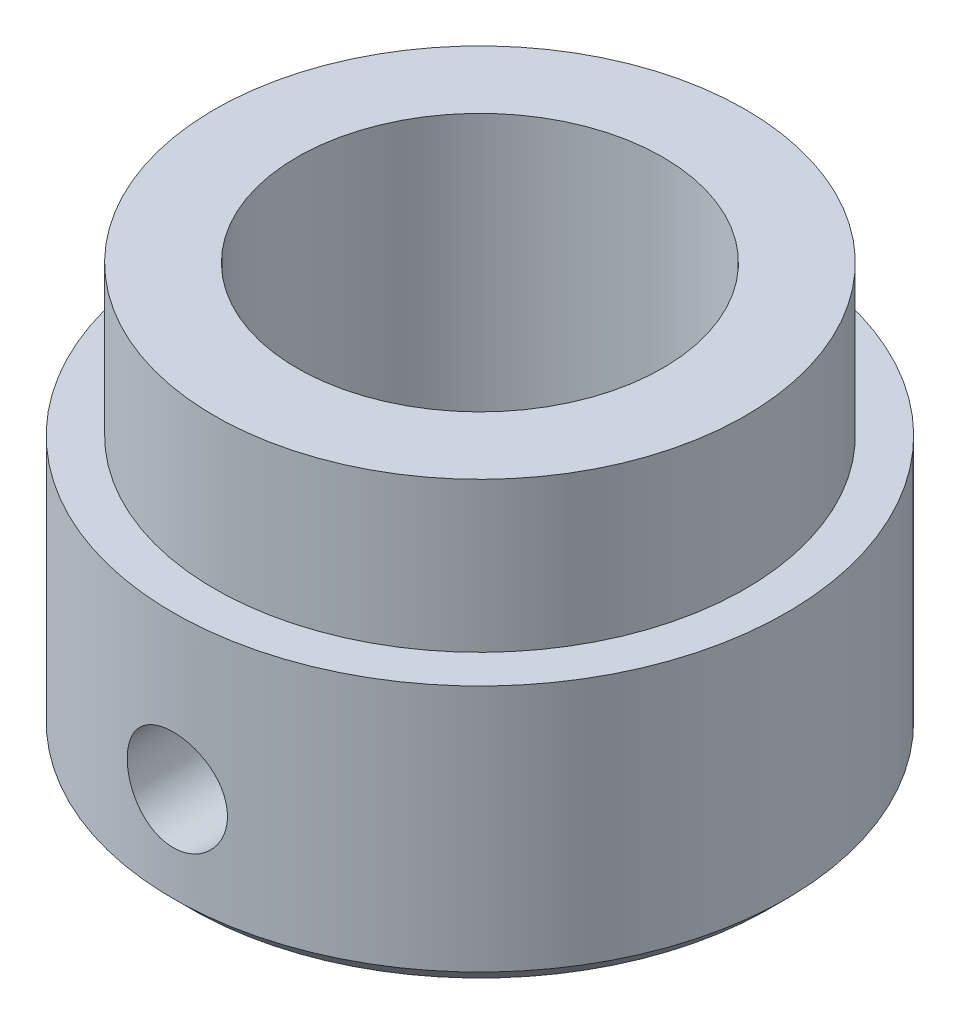
ISO-10303-21;
HEADER;
FILE_DESCRIPTION(('STEP AP214'),'2;1');
FILE_NAME('part.step','',(''),(''),'','','');
FILE_SCHEMA(('AUTOMOTIVE_DESIGN { 1 0 10303 214 1 1 1 1 }'));
ENDSEC;
DATA;
#1=APPLICATION_CONTEXT('core data for automotive mechanical design processes');
#2=APPLICATION_PROTOCOL_DEFINITION('international standard','automotive_design',2000,#1);
#3=PRODUCT_CONTEXT('',#1,'mechanical');
#4=PRODUCT('Part','Part','',(#3));
#5=PRODUCT_RELATED_PRODUCT_CATEGORY('part','',(#4));
#6=PRODUCT_DEFINITION_FORMATION('','',#4);
#7=PRODUCT_DEFINITION_CONTEXT('part definition',#1,'design');
#8=PRODUCT_DEFINITION('design','',#6,#7);
#9=PRODUCT_DEFINITION_SHAPE('','',#8);
#10=(LENGTH_UNIT() NAMED_UNIT(*) SI_UNIT(.MILLI.,.METRE.));
#11=(NAMED_UNIT(*) PLANE_ANGLE_UNIT() SI_UNIT($,.RADIAN.));
#12=(NAMED_UNIT(*) SI_UNIT($,.STERADIAN.) SOLID_ANGLE_UNIT());
#13=UNCERTAINTY_MEASURE_WITH_UNIT(LENGTH_MEASURE(1.E-05),#10,'distance_accuracy_value','');
#14=(GEOMETRIC_REPRESENTATION_CONTEXT(3) GLOBAL_UNCERTAINTY_ASSIGNED_CONTEXT((#13)) GLOBAL_UNIT_ASSIGNED_CONTEXT((#10,
#11,#12)) REPRESENTATION_CONTEXT('',''));
#15=CARTESIAN_POINT('',(0.,0.,0.));
#16=DIRECTION('',(0.,0.,1.));
#17=DIRECTION('',(1.,0.,0.));
#18=AXIS2_PLACEMENT_3D('',#15,#16,#17);
#19=CARTESIAN_POINT('',(0.,35.2,-22.5));
#20=DIRECTION('',(0.,1.,0.));
#21=DIRECTION('',(0.,0.,1.));
#22=AXIS2_PLACEMENT_3D('',#19,#20,#21);
#23=PLANE('',#22);
#24=CARTESIAN_POINT('',(0.,35.2,0.));
#25=DIRECTION('',(0.,-1.,0.));
#26=DIRECTION('',(0.,0.,-1.));
#27=AXIS2_PLACEMENT_3D('',#24,#25,#26);
#28=CIRCLE('',#27,15.5);
#29=CARTESIAN_POINT('',(0.,35.2,-15.5));
#30=VERTEX_POINT('',#29);
#31=EDGE_CURVE('E52',#30,#30,#28,.T.);
#32=ORIENTED_EDGE('',*,*,#31,.T.);
#33=EDGE_LOOP('',(#32));
#34=FACE_BOUND('',#33,.T.);
#35=CARTESIAN_POINT('',(0.,35.2,0.));
#36=DIRECTION('',(0.,-1.,0.));
#37=DIRECTION('',(0.,0.,-1.));
#38=AXIS2_PLACEMENT_3D('',#35,#36,#37);
#39=CIRCLE('',#38,22.5);
#40=CARTESIAN_POINT('',(0.,35.2,-22.5));
#41=VERTEX_POINT('',#40);
#42=EDGE_CURVE('E116',#41,#41,#39,.T.);
#43=ORIENTED_EDGE('',*,*,#42,.F.);
#44=EDGE_LOOP('',(#43));
#45=FACE_BOUND('',#44,.T.);
#46=ADVANCED_FACE('F37',(#34,#45),#23,.T.);
#47=CARTESIAN_POINT('',(0.,0.,0.));
#48=DIRECTION('',(0.,-1.,0.));
#49=DIRECTION('',(0.,0.,-1.));
#50=AXIS2_PLACEMENT_3D('',#47,#48,#49);
#51=CYLINDRICAL_SURFACE('',#50,15.5);
#52=CARTESIAN_POINT('',(0.,13.75,-15.5));
#53=CARTESIAN_POINT('',(-0.234044001094828,13.7499949715793,-15.499996731683));
#54=CARTESIAN_POINT('',(-0.468140955193607,13.7306024008031,-15.4946471869299));
#55=CARTESIAN_POINT('',(-0.929575137245832,13.6536918309459,-15.4738269408786));
#56=CARTESIAN_POINT('',(-1.15690933644533,13.5961570103571,-15.4583517740144));
#57=CARTESIAN_POINT('',(-1.59809192774814,13.4449852044156,-15.4189856764472));
#58=CARTESIAN_POINT('',(-1.81195782155555,13.3513962458422,-15.3951059448869));
#59=CARTESIAN_POINT('',(-2.22095917984194,13.1309550198842,-15.341445268166));
#60=CARTESIAN_POINT('',(-2.41609311354263,13.0041000371514,-15.3116638413264));
#61=CARTESIAN_POINT('',(-2.78685169926926,12.7174616144645,-15.2485943993305));
#62=CARTESIAN_POINT('',(-2.96195434683536,12.5570167481063,-15.2152437821519));
#63=CARTESIAN_POINT('',(-3.28313469107956,12.2091659503002,-15.1491903955612));
#64=CARTESIAN_POINT('',(-3.42920842010207,12.0217563393536,-15.116487715258));
#65=CARTESIAN_POINT('',(-3.69077270707633,11.6210754362609,-15.0547879758193));
#66=CARTESIAN_POINT('',(-3.80565486995462,11.4073937404046,-15.0258696546645));
#67=CARTESIAN_POINT('',(-3.99765325734526,10.9628261755669,-14.9759366632652));
#68=CARTESIAN_POINT('',(-4.07477689094871,10.7319436920281,-14.954920442635));
#69=CARTESIAN_POINT('',(-4.18724098268469,10.2653279855075,-14.9238188380682));
#70=CARTESIAN_POINT('',(-4.22353143606881,10.0298406760787,-14.9134854022584));
#71=CARTESIAN_POINT('',(-4.25626189725561,9.55591100621531,-14.9041789095926));
#72=CARTESIAN_POINT('',(-4.25270981543657,9.31746924175145,-14.9052035976823));
#73=CARTESIAN_POINT('',(-4.20660848470758,8.85187925134541,-14.9182760282656));
#74=CARTESIAN_POINT('',(-4.1652172768483,8.62460569396154,-14.9299964173477));
#75=CARTESIAN_POINT('',(-4.04647089890425,8.18035961235423,-14.9626143320436));
#76=CARTESIAN_POINT('',(-3.96911270819449,7.96338795500518,-14.98351262844));
#77=CARTESIAN_POINT('',(-3.77970462779636,7.54292667200969,-15.0324136439593));
#78=CARTESIAN_POINT('',(-3.66725541632669,7.33962675940414,-15.0604974324522));
#79=CARTESIAN_POINT('',(-3.41113562126779,6.95437915555299,-15.1205625276303));
#80=CARTESIAN_POINT('',(-3.26745857659147,6.77243589504723,-15.1525446402825));
#81=CARTESIAN_POINT('',(-2.94707704301829,6.42845986304408,-15.2181579180777));
#82=CARTESIAN_POINT('',(-2.76940246030864,6.26733289294649,-15.251807868619));
#83=CARTESIAN_POINT('',(-2.38914055693715,5.97697070036936,-15.3159763811667));
#84=CARTESIAN_POINT('',(-2.18655214052904,5.84773688134868,-15.3464948053358));
#85=CARTESIAN_POINT('',(-1.76075824631216,5.62439875569531,-15.4011675640127));
#86=CARTESIAN_POINT('',(-1.53745833078028,5.53046632774554,-15.4252905965909));
#87=CARTESIAN_POINT('',(-1.07742212093377,5.38174038619159,-15.4642286659677));
#88=CARTESIAN_POINT('',(-0.840688950295692,5.3269378135333,-15.47904585709));
#89=CARTESIAN_POINT('',(-0.368229946585817,5.25946789596467,-15.4973736882661));
#90=CARTESIAN_POINT('',(-0.132692392724793,5.24556993014552,-15.5012144495724));
#91=CARTESIAN_POINT('',(0.33735084052852,5.25689425513536,-15.4981099773144));
#92=CARTESIAN_POINT('',(0.571856630335981,5.28211225250341,-15.4911659275108));
#93=CARTESIAN_POINT('',(1.02873270088103,5.36994599320293,-15.4674860084727));
#94=CARTESIAN_POINT('',(1.25124658803462,5.4318682619595,-15.4509318255765));
#95=CARTESIAN_POINT('',(1.68270126622545,5.59054125016057,-15.4099163482131));
#96=CARTESIAN_POINT('',(1.89164054218499,5.68729584942477,-15.3854541729405));
#97=CARTESIAN_POINT('',(2.29474224666484,5.91512203120913,-15.3305712481264));
#98=CARTESIAN_POINT('',(2.48851602769114,6.04685373750241,-15.3000390711386));
#99=CARTESIAN_POINT('',(2.85163728322288,6.34007113627468,-15.2365416583241));
#100=CARTESIAN_POINT('',(3.02097963448717,6.50156305331177,-15.203575914366));
#101=CARTESIAN_POINT('',(3.33566884782591,6.85547070265499,-15.1377003503809));
#102=CARTESIAN_POINT('',(3.48014547996119,7.04866753572763,-15.1048217556789));
#103=CARTESIAN_POINT('',(3.73465585782006,7.45726507967922,-15.0439202027301));
#104=CARTESIAN_POINT('',(3.84469096511805,7.67266491236089,-15.0158970525529));
#105=CARTESIAN_POINT('',(4.02637194319855,8.11853924080239,-14.9682048735325));
#106=CARTESIAN_POINT('',(4.09823434046443,8.34892020671649,-14.9484888591061));
#107=CARTESIAN_POINT('',(4.20200511593053,8.81913411036364,-14.9196551229962));
#108=CARTESIAN_POINT('',(4.23392442533741,9.05896444355182,-14.9105345017253));
#109=CARTESIAN_POINT('',(4.25624818687573,9.53233280808543,-14.9041761336467));
#110=CARTESIAN_POINT('',(4.24805532970032,9.76580025773756,-14.9065368731631));
#111=CARTESIAN_POINT('',(4.19366154127966,10.2278879581205,-14.9219296692385));
#112=CARTESIAN_POINT('',(4.14746169665383,10.4565083472371,-14.9349614207134));
#113=CARTESIAN_POINT('',(4.01919971009858,10.9005332611036,-14.9699820288537));
#114=CARTESIAN_POINT('',(3.93745084277996,11.1160348983246,-14.9918925294361));
#115=CARTESIAN_POINT('',(3.74065386562867,11.5304302521745,-15.0421999009591));
#116=CARTESIAN_POINT('',(3.62560026430372,11.7293212229588,-15.0705978414262));
#117=CARTESIAN_POINT('',(3.36127670626323,12.111505186541,-15.1317789550165));
#118=CARTESIAN_POINT('',(3.21105727787171,12.294124197332,-15.1646707151057));
#119=CARTESIAN_POINT('',(2.88245093271624,12.6320176921118,-15.2305453174083));
#120=CARTESIAN_POINT('',(2.70405708806336,12.7872854307005,-15.2635281800583));
#121=CARTESIAN_POINT('',(2.31921438798124,13.0695923409439,-15.3267768363415));
#122=CARTESIAN_POINT('',(2.11221446041559,13.195899803058,-15.3569626516391));
#123=CARTESIAN_POINT('',(1.6790946232493,13.4117263385824,-15.4103247757236));
#124=CARTESIAN_POINT('',(1.452986386777,13.5012676790432,-15.4335053249301));
#125=CARTESIAN_POINT('',(1.0232861933147,13.6301160119318,-15.4674539867558));
#126=CARTESIAN_POINT('',(0.821445326763272,13.6749645042732,-15.4795673114937));
#127=CARTESIAN_POINT('',(0.413083039792351,13.7349070592233,-15.4958413172267));
#128=CARTESIAN_POINT('',(0.206562143617999,13.7500044379747,-15.5000028845455));
#129=CARTESIAN_POINT('',(0.,13.75,-15.5));
#130=B_SPLINE_CURVE_WITH_KNOTS('',3,(#52,#53,#54,#55,#56,#57,#58,#59,#60,#61,#62,#63,#64,#65,
#66,#67,#68,#69,#70,#71,#72,#73,#74,#75,#76,#77,#78,#79,#80,#81,#82,#83,#84,#85,#86,#87,#88,#89,
#90,#91,#92,#93,#94,#95,#96,#97,#98,#99,#100,#101,#102,#103,#104,#105,#106,#107,#108,#109,#110,
#111,#112,#113,#114,#115,#116,#117,#118,#119,#120,#121,#122,#123,#124,#125,#126,#127,#128,#129),
.UNSPECIFIED.,.T.,.F.,(4,2,2,2,2,2,2,2,2,2,2,2,2,2,2,2,2,2,2,2,2,2,2,2,2,2,2,2,2,2,2,2,2,2,2,2,
2,2,4),(0.,0.701374224424725,1.40305797510329,2.1038102451622,2.80461973212783,3.52080598898643,
4.23709006654045,4.96647824341192,5.69572324014229,6.40762671701645,7.1193888543378,
7.81007170937728,8.50081258070493,9.19971956028486,9.89877128269117,10.6219904743086,
11.3452414855307,12.0719696590743,12.7985295312965,13.5029953113035,14.2073837733063,
14.8988699682275,15.590433208589,16.2961116879339,17.0019379327788,17.7288967373787,
18.4558267995356,19.1785882449314,19.9011518492435,20.5986322210377,21.2960926525672,
21.9875274908931,22.6790764023118,23.3920462535982,24.1051916928481,24.8347458454454,
25.563857496486,26.1829441372441,26.8019617689624),.UNSPECIFIED.);
#131=CARTESIAN_POINT('',(0.,13.75,-15.5));
#132=VERTEX_POINT('',#131);
#133=EDGE_CURVE('E83',#132,#132,#130,.T.);
#134=ORIENTED_EDGE('',*,*,#133,.F.);
#135=EDGE_LOOP('',(#134));
#136=FACE_BOUND('',#135,.T.);
#137=CARTESIAN_POINT('',(4.25,9.5,14.9059551857638));
#138=CARTESIAN_POINT('',(4.24999488522442,9.26614256857367,14.9059589746067));
#139=CARTESIAN_POINT('',(4.2306321464448,9.0322320276617,14.9115188036944));
#140=CARTESIAN_POINT('',(4.15385079292532,8.57118432527488,14.933086165905));
#141=CARTESIAN_POINT('',(4.09641450051364,8.34405036140302,14.9490985521307));
#142=CARTESIAN_POINT('',(3.94553055670862,7.9032927776466,14.9896241970184));
#143=CARTESIAN_POINT('',(3.85213551620893,7.68964994811186,15.014125031094));
#144=CARTESIAN_POINT('',(3.63215195534969,7.28102739819685,15.0688509028496));
#145=CARTESIAN_POINT('',(3.50556032035812,7.08604943137011,15.0990764775727));
#146=CARTESIAN_POINT('',(3.21919692306056,6.71513623875528,15.1627418652733));
#147=CARTESIAN_POINT('',(3.05870439202163,6.53976758531231,15.1962412382274));
#148=CARTESIAN_POINT('',(2.71064396300684,6.21806776129983,15.2621667890378));
#149=CARTESIAN_POINT('',(2.52307312461681,6.07173974833607,15.2945928498733));
#150=CARTESIAN_POINT('',(2.12222978962298,5.80989130254843,15.3553854582037));
#151=CARTESIAN_POINT('',(1.9085743727651,5.69493725784382,15.3836735693965));
#152=CARTESIAN_POINT('',(1.46406257328754,5.50279896552384,15.4323177349872));
#153=CARTESIAN_POINT('',(1.23320927244565,5.425607969622,15.4526752064641));
#154=CARTESIAN_POINT('',(0.766771757966198,5.31302953418498,15.4827431563299));
#155=CARTESIAN_POINT('',(0.531436426250142,5.27667757857654,15.4926988815174));
#156=CARTESIAN_POINT('',(0.0578109376308842,5.24377128049483,15.5017004118799));
#157=CARTESIAN_POINT('',(-0.180478690084377,5.24720991055268,15.5007481435306));
#158=CARTESIAN_POINT('',(-0.646523777582163,5.29311481240315,15.4882193102903));
#159=CARTESIAN_POINT('',(-0.874390731987514,5.33453851377806,15.4769265705426));
#160=CARTESIAN_POINT('',(-1.31980593378543,5.45354934633012,15.4453227170116));
#161=CARTESIAN_POINT('',(-1.53735357567812,5.53113859668585,15.4250110747544));
#162=CARTESIAN_POINT('',(-1.95857637040681,5.72105657457729,15.3772368866856));
#163=CARTESIAN_POINT('',(-2.16208489172742,5.83373608788395,15.3497025975388));
#164=CARTESIAN_POINT('',(-2.54765573900489,6.0903651564166,15.2904400787306));
#165=CARTESIAN_POINT('',(-2.72971366804827,6.23432110550549,15.2587109920439));
#166=CARTESIAN_POINT('',(-3.07343931000041,6.55492442465957,15.1932749745252));
#167=CARTESIAN_POINT('',(-3.2342550452912,6.73248003541333,15.1595372699986));
#168=CARTESIAN_POINT('',(-3.52404291190806,7.11238575469614,15.0948080169217));
#169=CARTESIAN_POINT('',(-3.6530128647999,7.31473755801115,15.0638166563299));
#170=CARTESIAN_POINT('',(-3.87614695434801,7.74042342795397,15.0079600434263));
#171=CARTESIAN_POINT('',(-3.97006688744778,7.96389159483895,14.9831381611681));
#172=CARTESIAN_POINT('',(-4.11871871775667,8.4242991756873,14.9429632788265));
#173=CARTESIAN_POINT('',(-4.17346097759179,8.66123500949656,14.9276077750034));
#174=CARTESIAN_POINT('',(-4.24070836537975,9.13385330717402,14.9086412339289));
#175=CARTESIAN_POINT('',(-4.2544896602924,9.36934014721619,14.9046754782247));
#176=CARTESIAN_POINT('',(-4.24295040309154,9.83925604655831,14.9079646659928));
#177=CARTESIAN_POINT('',(-4.21763428537876,10.0736852227934,14.9152183369659));
#178=CARTESIAN_POINT('',(-4.12974654456128,10.5298283303444,14.9397852018906));
#179=CARTESIAN_POINT('',(-4.06795367751815,10.7517047571499,14.9568879428801));
#180=CARTESIAN_POINT('',(-3.90974796893045,11.1819408324437,14.9990175933463));
#181=CARTESIAN_POINT('',(-3.81333041800275,11.3902986376794,15.0240455806992));
#182=CARTESIAN_POINT('',(-3.58605876975781,11.792890051029,15.0799249947056));
#183=CARTESIAN_POINT('',(-3.45446167916886,11.986687033127,15.1108974254731));
#184=CARTESIAN_POINT('',(-3.16147897621473,12.3499157488401,15.1748967565304));
#185=CARTESIAN_POINT('',(-3.00008743196616,12.5193426185513,15.2079240650634));
#186=CARTESIAN_POINT('',(-2.64617301921003,12.8343801839865,15.2735419232601));
#187=CARTESIAN_POINT('',(-2.4528450473104,12.9790976488661,15.3060877641918));
#188=CARTESIAN_POINT('',(-2.04390471018054,13.2340321586472,15.3660370665979));
#189=CARTESIAN_POINT('',(-1.82829353031725,13.3442510374639,15.3934408013913));
#190=CARTESIAN_POINT('',(-1.38242251921242,13.5260288888176,15.4398416416358));
#191=CARTESIAN_POINT('',(-1.15228833379477,13.5978791468457,15.4589018834113));
#192=CARTESIAN_POINT('',(-0.682608118597716,13.7017084949336,15.4867465190554));
#193=CARTESIAN_POINT('',(-0.443064317210364,13.7336969670675,15.4955333309009));
#194=CARTESIAN_POINT('',(0.0303110813249571,13.7562791558743,15.5017196678931));
#195=CARTESIAN_POINT('',(0.264076498197164,13.7481796490136,15.4994786878097));
#196=CARTESIAN_POINT('',(0.726785748202859,13.6938693918905,15.4846816527614));
#197=CARTESIAN_POINT('',(0.955729780771844,13.6476602212142,15.4721260253226));
#198=CARTESIAN_POINT('',(1.40063034563143,13.5191977944424,15.4381889050738));
#199=CARTESIAN_POINT('',(1.61667285445488,13.4372230594416,15.4168756844443));
#200=CARTESIAN_POINT('',(2.03205974292101,13.2398043886581,15.3676455958709));
#201=CARTESIAN_POINT('',(2.23140167519126,13.1243555584609,15.3397277623435));
#202=CARTESIAN_POINT('',(2.61375767900485,12.8595167015816,15.2792934706519));
#203=CARTESIAN_POINT('',(2.79616151720711,12.709270066712,15.2466704959798));
#204=CARTESIAN_POINT('',(3.13360889027574,12.3807071847019,15.180912762456));
#205=CARTESIAN_POINT('',(3.28864507418654,12.202383420301,15.1477778686939));
#206=CARTESIAN_POINT('',(3.5705945393854,11.8176626578838,15.0838420957925));
#207=CARTESIAN_POINT('',(3.69675701088007,11.6107020291748,15.0531148378429));
#208=CARTESIAN_POINT('',(3.91232224262959,11.1776898453251,14.9985392398652));
#209=CARTESIAN_POINT('',(4.00174772672291,10.9516501962378,14.9746866502117));
#210=CARTESIAN_POINT('',(4.130366453834,10.5222248559673,14.9396718733312));
#211=CARTESIAN_POINT('',(4.17511996078345,10.3206003557513,14.9271339479147));
#212=CARTESIAN_POINT('',(4.23493706424274,9.91266394632066,14.910274465581));
#213=CARTESIAN_POINT('',(4.25000451320911,9.70635264884239,14.9059518425399));
#214=CARTESIAN_POINT('',(4.25,9.5,14.9059551857638));
#215=B_SPLINE_CURVE_WITH_KNOTS('',3,(#137,#138,#139,#140,#141,#142,#143,#144,#145,#146,#147,
#148,#149,#150,#151,#152,#153,#154,#155,#156,#157,#158,#159,#160,#161,#162,#163,#164,#165,#166,
#167,#168,#169,#170,#171,#172,#173,#174,#175,#176,#177,#178,#179,#180,#181,#182,#183,#184,#185,
#186,#187,#188,#189,#190,#191,#192,#193,#194,#195,#196,#197,#198,#199,#200,#201,#202,#203,#204,
#205,#206,#207,#208,#209,#210,#211,#212,#213,#214),.UNSPECIFIED.,.T.,.F.,(4,2,2,2,2,2,2,2,2,2,2,
2,2,2,2,2,2,2,2,2,2,2,2,2,2,2,2,2,2,2,2,2,2,2,2,2,2,2,4),(0.,0.700813005442091,1.40195162871364,
2.10206829737107,2.80225067718093,3.51916932831063,4.2361658877673,4.96535881153612,
5.6944213803148,6.40587747651871,7.11720792342214,7.80958065973359,8.50199397184189,
9.20156422715698,9.90127763088444,10.6236664765061,11.3461047239884,12.0734863818195,
12.8006755735845,13.5049580187297,14.2091605905273,14.8988464856264,15.588626222046,
16.2943159100148,17.0001462480639,17.7276948828281,18.4552048351627,19.1771102232133,
19.8988456678026,20.5972121802511,21.2955497479552,21.98854352139,22.6816386720414,
23.3940589625465,24.1066703190278,24.8361145903639,25.5651069786262,26.183575204833,
26.8019631651135),.UNSPECIFIED.);
#216=CARTESIAN_POINT('',(4.25,9.5,14.9059551857638));
#217=VERTEX_POINT('',#216);
#218=EDGE_CURVE('E78',#217,#217,#215,.T.);
#219=ORIENTED_EDGE('',*,*,#218,.F.);
#220=EDGE_LOOP('',(#219));
#221=FACE_BOUND('',#220,.T.);
#222=CARTESIAN_POINT('',(0.,0.,0.));
#223=DIRECTION('',(0.,-1.,0.));
#224=DIRECTION('',(0.,0.,-1.));
#225=AXIS2_PLACEMENT_3D('',#222,#223,#224);
#226=CIRCLE('',#225,15.5);
#227=CARTESIAN_POINT('',(0.,0.,-15.5));
#228=VERTEX_POINT('',#227);
#229=EDGE_CURVE('E56',#228,#228,#226,.T.);
#230=ORIENTED_EDGE('',*,*,#229,.T.);
#231=EDGE_LOOP('',(#230));
#232=FACE_BOUND('',#231,.T.);
#233=ORIENTED_EDGE('',*,*,#31,.F.);
#234=EDGE_LOOP('',(#233));
#235=FACE_BOUND('',#234,.T.);
#236=ADVANCED_FACE('F88',(#136,#221,#232,#235),#51,.F.);
#237=CARTESIAN_POINT('',(0.,0.,-15.5));
#238=DIRECTION('',(0.,-1.,0.));
#239=DIRECTION('',(0.,0.,-1.));
#240=AXIS2_PLACEMENT_3D('',#237,#238,#239);
#241=PLANE('',#240);
#242=CARTESIAN_POINT('',(0.,0.,0.));
#243=DIRECTION('',(0.,-1.,0.));
#244=DIRECTION('',(0.,0.,-1.));
#245=AXIS2_PLACEMENT_3D('',#242,#243,#244);
#246=CIRCLE('',#245,24.5);
#247=CARTESIAN_POINT('',(0.,0.,-24.5));
#248=VERTEX_POINT('',#247);
#249=EDGE_CURVE('E128',#248,#248,#246,.T.);
#250=ORIENTED_EDGE('',*,*,#249,.T.);
#251=EDGE_LOOP('',(#250));
#252=FACE_BOUND('',#251,.T.);
#253=ORIENTED_EDGE('',*,*,#229,.F.);
#254=EDGE_LOOP('',(#253));
#255=FACE_BOUND('',#254,.T.);
#256=ADVANCED_FACE('F92',(#252,#255),#241,.T.);
#257=CARTESIAN_POINT('',(0.,0.,0.));
#258=DIRECTION('',(0.,1.,0.));
#259=DIRECTION('',(0.,0.,1.));
#260=AXIS2_PLACEMENT_3D('',#257,#258,#259);
#261=CONICAL_SURFACE('',#260,24.5,0.785398163397449);
#262=CARTESIAN_POINT('',(0.,1.5,0.));
#263=DIRECTION('',(0.,-1.,0.));
#264=DIRECTION('',(0.,0.,-1.));
#265=AXIS2_PLACEMENT_3D('',#262,#263,#264);
#266=CIRCLE('',#265,26.);
#267=CARTESIAN_POINT('',(0.,1.5,-26.));
#268=VERTEX_POINT('',#267);
#269=EDGE_CURVE('E126',#268,#268,#266,.T.);
#270=ORIENTED_EDGE('',*,*,#269,.T.);
#271=EDGE_LOOP('',(#270));
#272=FACE_BOUND('',#271,.T.);
#273=ORIENTED_EDGE('',*,*,#249,.F.);
#274=EDGE_LOOP('',(#273));
#275=FACE_BOUND('',#274,.T.);
#276=ADVANCED_FACE('F96',(#272,#275),#261,.T.);
#277=CARTESIAN_POINT('',(0.,0.,0.));
#278=DIRECTION('',(0.,-1.,0.));
#279=DIRECTION('',(0.,0.,-1.));
#280=AXIS2_PLACEMENT_3D('',#277,#278,#279);
#281=CYLINDRICAL_SURFACE('',#280,26.);
#282=CARTESIAN_POINT('',(0.,13.75,-26.));
#283=CARTESIAN_POINT('',(0.237030893715671,13.7499904386207,-25.9999959843863));
#284=CARTESIAN_POINT('',(0.474192789082695,13.7301035009631,-25.9967248315162));
#285=CARTESIAN_POINT('',(0.941869455044772,13.6511116775895,-25.9839905154835));
#286=CARTESIAN_POINT('',(1.17237783270769,13.5919703033016,-25.9745215913577));
#287=CARTESIAN_POINT('',(1.61991309164383,13.4362992147616,-25.9504542045092));
#288=CARTESIAN_POINT('',(1.83695067088969,13.339799621419,-25.9358598751384));
#289=CARTESIAN_POINT('',(2.25172471684522,13.1122292010666,-25.9031479622084));
#290=CARTESIAN_POINT('',(2.44946348132742,12.9811624966133,-25.8850307988585));
#291=CARTESIAN_POINT('',(2.82187696355581,12.686893715683,-25.8470962904092));
#292=CARTESIAN_POINT('',(2.99634813195978,12.5234356567567,-25.8272661618984));
#293=CARTESIAN_POINT('',(3.31551596631869,12.1695751113163,-25.7882389858303));
#294=CARTESIAN_POINT('',(3.46021078722894,11.9791709563625,-25.7690419775653));
#295=CARTESIAN_POINT('',(3.71652968681509,11.575430899586,-25.7333307588664));
#296=CARTESIAN_POINT('',(3.82795334443348,11.3619661697265,-25.7168330675111));
#297=CARTESIAN_POINT('',(4.01328551957208,10.9190356710022,-25.6885652205212));
#298=CARTESIAN_POINT('',(4.08719647223682,10.6895709418807,-25.676794758028));
#299=CARTESIAN_POINT('',(4.19476566302273,10.2233084931295,-25.6594410105284));
#300=CARTESIAN_POINT('',(4.22877474385917,9.98659375833733,-25.6538038302395));
#301=CARTESIAN_POINT('',(4.25666240583644,9.51075559532394,-25.6491917600011));
#302=CARTESIAN_POINT('',(4.25054371915908,9.27163233219918,-25.6502164164665));
#303=CARTESIAN_POINT('',(4.19863549358806,8.80026420118817,-25.6587630237959));
#304=CARTESIAN_POINT('',(4.15323939939935,8.56797466808169,-25.666220534054));
#305=CARTESIAN_POINT('',(4.0246821267083,8.11435419191395,-25.686691745627));
#306=CARTESIAN_POINT('',(3.9415196980688,7.89302361188379,-25.6997056308675));
#307=CARTESIAN_POINT('',(3.7393894781882,7.46642211041524,-25.7298931810594));
#308=CARTESIAN_POINT('',(3.62025765425718,7.26123030875886,-25.7470858310337));
#309=CARTESIAN_POINT('',(3.34968689151333,6.87360031800214,-25.7836804455987));
#310=CARTESIAN_POINT('',(3.19824544238302,6.69116389864243,-25.8030825818023));
#311=CARTESIAN_POINT('',(2.86520741222695,6.35194536239223,-25.8421935028566));
#312=CARTESIAN_POINT('',(2.68327311943683,6.19549471828884,-25.861903187468));
#313=CARTESIAN_POINT('',(2.29555777594722,5.91529321390681,-25.8991945881277));
#314=CARTESIAN_POINT('',(2.08977658226813,5.79154254970304,-25.9167762914157));
#315=CARTESIAN_POINT('',(1.6599020187842,5.58022630445126,-25.9478543380278));
#316=CARTESIAN_POINT('',(1.43579437206252,5.4926892629246,-25.9613474569558));
#317=CARTESIAN_POINT('',(0.975788607659865,5.35658883446804,-25.9827019380304));
#318=CARTESIAN_POINT('',(0.739891439916968,5.3080223128579,-25.9905637531379));
#319=CARTESIAN_POINT('',(0.265860644012904,5.25168918239292,-25.9997090883896));
#320=CARTESIAN_POINT('',(0.0277824741011702,5.24346739749684,-26.0010659939609));
#321=CARTESIAN_POINT('',(-0.446350214545649,5.26684467850242,-25.9972493734327));
#322=CARTESIAN_POINT('',(-0.682404807755132,5.29844227252797,-25.992076088714));
#323=CARTESIAN_POINT('',(-1.14438911386152,5.4001827946623,-25.9758257866223));
#324=CARTESIAN_POINT('',(-1.37036961120045,5.47010109155537,-25.9647831857457));
#325=CARTESIAN_POINT('',(-1.80740119252189,5.64625934794447,-25.9380276508021));
#326=CARTESIAN_POINT('',(-2.01845146408747,5.75250128213177,-25.9223144628303));
#327=CARTESIAN_POINT('',(-2.42161366859891,5.99933856105691,-25.8877793941601));
#328=CARTESIAN_POINT('',(-2.61354876552231,6.14021911741489,-25.8689321477118));
#329=CARTESIAN_POINT('',(-2.97121546929126,6.45194127452841,-25.8302981025735));
#330=CARTESIAN_POINT('',(-3.13694524816762,6.62278496363025,-25.810511238465));
#331=CARTESIAN_POINT('',(-3.4391779108634,6.99162225262504,-25.7719916836058));
#332=CARTESIAN_POINT('',(-3.57537373043705,7.18986896989313,-25.7532714341061));
#333=CARTESIAN_POINT('',(-3.81252988324652,7.60669431769085,-25.7192346273782));
#334=CARTESIAN_POINT('',(-3.91349130208681,7.82527232153188,-25.7039179652878));
#335=CARTESIAN_POINT('',(-4.07685013284615,8.27568564135995,-25.6785152534636));
#336=CARTESIAN_POINT('',(-4.13940213256642,8.50746365628092,-25.6684082629192));
#337=CARTESIAN_POINT('',(-4.22465413023572,8.97841520113483,-25.6545160786691));
#338=CARTESIAN_POINT('',(-4.24735744832421,9.21758811324484,-25.6507303582847));
#339=CARTESIAN_POINT('',(-4.25217773569158,9.69347513855405,-25.6499314486389));
#340=CARTESIAN_POINT('',(-4.23477792506155,9.93018436120687,-25.6528376253944));
#341=CARTESIAN_POINT('',(-4.16092887802614,10.3972595271028,-25.6649186329447));
#342=CARTESIAN_POINT('',(-4.10447975451213,10.6276254886822,-25.6740934456169));
#343=CARTESIAN_POINT('',(-3.95431677453723,11.075298585998,-25.6976478000244));
#344=CARTESIAN_POINT('',(-3.86064296352505,11.2926194670811,-25.7120217471652));
#345=CARTESIAN_POINT('',(-3.63873895824291,11.7085392141282,-25.7443604698209));
#346=CARTESIAN_POINT('',(-3.51050715751216,11.9071372091618,-25.7623254122567));
#347=CARTESIAN_POINT('',(-3.22139637385406,12.2824178849504,-25.8000782965771));
#348=CARTESIAN_POINT('',(-3.06016139338733,12.4588244900627,-25.8198847089752));
#349=CARTESIAN_POINT('',(-2.71037235072793,12.7822443533914,-25.8589401642605));
#350=CARTESIAN_POINT('',(-2.52181198502698,12.9292508108124,-25.8781890773093));
#351=CARTESIAN_POINT('',(-2.12124407398905,13.1905829726942,-25.9141079534248));
#352=CARTESIAN_POINT('',(-1.90908960808914,13.3046859479656,-25.9307600051697));
#353=CARTESIAN_POINT('',(-1.46844205341508,13.4954602079076,-25.9594344470184));
#354=CARTESIAN_POINT('',(-1.23996563331084,13.5721690717864,-25.9714614824538));
#355=CARTESIAN_POINT('',(-0.842144271498967,13.6691765299867,-25.9868819022963));
#356=CARTESIAN_POINT('',(-0.67521620557298,13.6994372393803,-25.9917751023232));
#357=CARTESIAN_POINT('',(-0.338881055943864,13.7398522297766,-25.9983355606201));
#358=CARTESIAN_POINT('',(-0.16947401241579,13.7500068362621,-26.0000028711117));
#359=CARTESIAN_POINT('',(0.,13.75,-26.));
#360=B_SPLINE_CURVE_WITH_KNOTS('',3,(#282,#283,#284,#285,#286,#287,#288,#289,#290,#291,#292,
#293,#294,#295,#296,#297,#298,#299,#300,#301,#302,#303,#304,#305,#306,#307,#308,#309,#310,#311,
#312,#313,#314,#315,#316,#317,#318,#319,#320,#321,#322,#323,#324,#325,#326,#327,#328,#329,#330,
#331,#332,#333,#334,#335,#336,#337,#338,#339,#340,#341,#342,#343,#344,#345,#346,#347,#348,#349,
#350,#351,#352,#353,#354,#355,#356,#357,#358,#359),.UNSPECIFIED.,.T.,.F.,(4,2,2,2,2,2,2,2,2,2,2,
2,2,2,2,2,2,2,2,2,2,2,2,2,2,2,2,2,2,2,2,2,2,2,2,2,2,2,4),(0.,0.710473245021016,1.421607830012,
2.13217023679819,2.8426479385018,3.55898201720006,4.27536046906027,4.99597105036091,
5.71653484710106,6.43071434415946,7.14484521533907,7.85190433206722,8.55898685549709,
9.26934390979011,9.97975617585207,10.6986306782882,11.4175094911256,12.1369537694035,
12.856340171782,13.5675913745449,14.2788162875219,14.9859159984919,15.6930541562092,
16.4062221877068,17.1194399447836,17.8397509067912,18.5600396733919,19.2774101333077,
19.9947208200278,20.7034335742145,21.4121442795244,22.1200946254716,22.8280778868377,
23.5441437024711,24.260374966211,24.9813464426506,25.701591877521,26.2095792494769,
26.7175583979343),.UNSPECIFIED.);
#361=CARTESIAN_POINT('',(0.,13.75,-26.));
#362=VERTEX_POINT('',#361);
#363=EDGE_CURVE('E10',#362,#362,#360,.T.);
#364=ORIENTED_EDGE('',*,*,#363,.F.);
#365=EDGE_LOOP('',(#364));
#366=FACE_BOUND('',#365,.T.);
#367=CARTESIAN_POINT('',(4.25,9.5,25.6502923959942));
#368=CARTESIAN_POINT('',(4.2499904186321,9.73700704595834,25.6502966176132));
#369=CARTESIAN_POINT('',(4.23010734734481,9.97414515400006,25.653612879286));
#370=CARTESIAN_POINT('',(4.15113227438561,10.4417724115968,25.6665081483159));
#371=CARTESIAN_POINT('',(4.09200369667733,10.6722551491813,25.6760929977506));
#372=CARTESIAN_POINT('',(3.93637002894311,11.1197361445521,25.7004115095384));
#373=CARTESIAN_POINT('',(3.83989566391929,11.3367453174024,25.7151409383892));
#374=CARTESIAN_POINT('',(3.61238468832126,11.7514715982029,25.748083966133));
#375=CARTESIAN_POINT('',(3.48135214032735,11.9491909700772,25.7662971554142));
#376=CARTESIAN_POINT('',(3.18711815495258,12.3216256534752,25.8043486078466));
#377=CARTESIAN_POINT('',(3.02365307956743,12.4961314362092,25.8241993537031));
#378=CARTESIAN_POINT('',(2.66976387570297,12.8153662762121,25.8631782485765));
#379=CARTESIAN_POINT('',(2.4793381741496,12.9600935947847,25.882306355347));
#380=CARTESIAN_POINT('',(2.07557854849145,13.2164470367675,25.9178165620762));
#381=CARTESIAN_POINT('',(1.86211950343245,13.3278785555813,25.9341822837793));
#382=CARTESIAN_POINT('',(1.41920133438648,13.5132268231571,25.9621849646041));
#383=CARTESIAN_POINT('',(1.18974321255796,13.5871459192448,25.9738222195987));
#384=CARTESIAN_POINT('',(0.723503822430013,13.6947313043504,25.9909686541658));
#385=CARTESIAN_POINT('',(0.486805740526493,13.7287494248976,25.9965313661615));
#386=CARTESIAN_POINT('',(0.0110003931082286,13.7566609396202,26.0010857817054));
#387=CARTESIAN_POINT('',(-0.228106713592784,13.7505569617651,26.000077915622));
#388=CARTESIAN_POINT('',(-0.699538205373105,13.6986725840117,25.9916471899203));
#389=CARTESIAN_POINT('',(-0.931905510702238,13.6532707982046,25.9842855475771));
#390=CARTESIAN_POINT('',(-1.38567856951425,13.5246754006557,25.964042664597));
#391=CARTESIAN_POINT('',(-1.6070839989737,13.4414806725264,25.9511612609094));
#392=CARTESIAN_POINT('',(-2.03377839516661,13.2392824499259,25.9212217801398));
#393=CARTESIAN_POINT('',(-2.23899178351921,13.1201222708109,25.9041454897378));
#394=CARTESIAN_POINT('',(-2.62665303717503,12.8494903784182,25.8677146323964));
#395=CARTESIAN_POINT('',(-2.80909912677739,12.6980161473484,25.8483598879811));
#396=CARTESIAN_POINT('',(-3.14828274550939,12.364954141289,25.8092591680998));
#397=CARTESIAN_POINT('',(-3.30469535359312,12.1830355215599,25.78951126298));
#398=CARTESIAN_POINT('',(-3.58482748091995,11.7953653374235,25.7520687977263));
#399=CARTESIAN_POINT('',(-3.70854672041836,11.5896135691067,25.7343742551628));
#400=CARTESIAN_POINT('',(-3.9198400397237,11.1597484415614,25.7030412667203));
#401=CARTESIAN_POINT('',(-4.00737614540526,10.9356160859927,25.6894070863553));
#402=CARTESIAN_POINT('',(-4.1434671997567,10.475556401516,25.6678100585854));
#403=CARTESIAN_POINT('',(-4.19202544212078,10.2396300710086,25.6598467319904));
#404=CARTESIAN_POINT('',(-4.24832723763537,9.76558343063872,25.6505854088555));
#405=CARTESIAN_POINT('',(-4.25653345198678,9.5275194979288,25.6492118608534));
#406=CARTESIAN_POINT('',(-4.23313011200173,9.05341896655109,25.6530845079761));
#407=CARTESIAN_POINT('',(-4.20152203450674,8.81738229301264,25.6583304575622));
#408=CARTESIAN_POINT('',(-4.09978140443568,8.35549888643173,25.6747812907915));
#409=CARTESIAN_POINT('',(-4.02988335026308,8.12959909320116,25.6859498893238));
#410=CARTESIAN_POINT('',(-3.85379245255012,7.69272001704693,25.7129572576314));
#411=CARTESIAN_POINT('',(-3.74759751246438,7.48174159684687,25.7287962971689));
#412=CARTESIAN_POINT('',(-3.50083145605498,7.07863208214273,25.7635359249494));
#413=CARTESIAN_POINT('',(-3.35996325166031,6.88668512865036,25.782462468015));
#414=CARTESIAN_POINT('',(-3.04825820533008,6.52898879212297,25.8211681966852));
#415=CARTESIAN_POINT('',(-2.87741933883971,6.36324118032426,25.8409474398225));
#416=CARTESIAN_POINT('',(-2.50857510136144,6.06096461970882,25.8793683553275));
#417=CARTESIAN_POINT('',(-2.31031558688396,5.92474383287734,25.8979967023062));
#418=CARTESIAN_POINT('',(-1.89345747073887,5.68754393122806,25.9318044945104));
#419=CARTESIAN_POINT('',(-1.67485950768859,5.58656371034643,25.9469840479749));
#420=CARTESIAN_POINT('',(-1.22445447169549,5.42319351927291,25.9721259188841));
#421=CARTESIAN_POINT('',(-0.992707692371678,5.36064084752569,25.9821102051118));
#422=CARTESIAN_POINT('',(-0.521822457989765,5.27537694151603,25.9958293311322));
#423=CARTESIAN_POINT('',(-0.282684588511241,5.25266255914698,25.9995646647294));
#424=CARTESIAN_POINT('',(0.193217375081144,5.24780785092048,26.0003584418624));
#425=CARTESIAN_POINT('',(0.429976683831753,5.26519812738097,25.9974941300975));
#426=CARTESIAN_POINT('',(0.897154516403295,5.33904563643745,25.9855677533614));
#427=CARTESIAN_POINT('',(1.12757307247381,5.39550267029855,25.9765057199185));
#428=CARTESIAN_POINT('',(1.57535943712047,5.54570362997767,25.9531982635306));
#429=CARTESIAN_POINT('',(1.79274043498919,5.63940911575987,25.938958185564));
#430=CARTESIAN_POINT('',(2.20876735209928,5.86139523199929,25.9068510515848));
#431=CARTESIAN_POINT('',(2.40741243765749,5.98967740002018,25.8889838342885));
#432=CARTESIAN_POINT('',(2.78269664194234,6.27884620062753,25.8513560684858));
#433=CARTESIAN_POINT('',(2.95906859631972,6.44007715949564,25.8315767948736));
#434=CARTESIAN_POINT('',(3.28242041505526,6.78984355840134,25.7924855690704));
#435=CARTESIAN_POINT('',(3.42939338484885,6.97838538547184,25.7731737274315));
#436=CARTESIAN_POINT('',(3.69068634490474,7.3789357070423,25.7370627908611));
#437=CARTESIAN_POINT('',(3.8047783709838,7.59109453046247,25.7202816057415));
#438=CARTESIAN_POINT('',(3.99553098156498,8.03175072287324,25.6913432842588));
#439=CARTESIAN_POINT('',(4.07222925203832,8.2602313750418,25.6791814951444));
#440=CARTESIAN_POINT('',(4.16920921399092,8.65802496771458,25.6635788168816));
#441=CARTESIAN_POINT('',(4.19945760699827,8.82491915343428,25.6586238526902));
#442=CARTESIAN_POINT('',(4.23985625378572,9.16118659210951,25.651979161001));
#443=CARTESIAN_POINT('',(4.25000684987596,9.33055980279224,25.6502893778901));
#444=CARTESIAN_POINT('',(4.25,9.5,25.6502923959942));
#445=B_SPLINE_CURVE_WITH_KNOTS('',3,(#367,#368,#369,#370,#371,#372,#373,#374,#375,#376,#377,
#378,#379,#380,#381,#382,#383,#384,#385,#386,#387,#388,#389,#390,#391,#392,#393,#394,#395,#396,
#397,#398,#399,#400,#401,#402,#403,#404,#405,#406,#407,#408,#409,#410,#411,#412,#413,#414,#415,
#416,#417,#418,#419,#420,#421,#422,#423,#424,#425,#426,#427,#428,#429,#430,#431,#432,#433,#434,
#435,#436,#437,#438,#439,#440,#441,#442,#443,#444),.UNSPECIFIED.,.T.,.F.,(4,2,2,2,2,2,2,2,2,2,2,
2,2,2,2,2,2,2,2,2,2,2,2,2,2,2,2,2,2,2,2,2,2,2,2,2,2,2,4),(0.,0.710401584482807,1.42146618061228,
2.13194701110605,2.84234435631194,3.55877223887961,4.27524194016891,4.99582078333792,
5.71635453099501,6.43048595233633,7.14457059903176,7.85185103437175,8.55915236383358,
9.26958067547256,9.98006436130285,10.6988406960331,11.4176231808593,12.1371581227675,
12.8566322563752,13.5678376189376,14.2790166013591,14.9858880449858,15.6928003251343,
16.4059943720025,17.1192366145628,17.839598137399,18.5599370488644,19.2772046506103,
19.9944155697861,20.7032746931593,21.412130210551,22.1202560873414,22.8284134584288,
23.5443890826222,24.2605324189896,24.9815275044123,25.7017944506846,26.2096807640042,
26.717558426817),.UNSPECIFIED.);
#446=CARTESIAN_POINT('',(4.25,9.5,25.6502923959942));
#447=VERTEX_POINT('',#446);
#448=EDGE_CURVE('E48',#447,#447,#445,.T.);
#449=ORIENTED_EDGE('',*,*,#448,.F.);
#450=EDGE_LOOP('',(#449));
#451=FACE_BOUND('',#450,.T.);
#452=CARTESIAN_POINT('',(0.,22.5,0.));
#453=DIRECTION('',(0.,-1.,0.));
#454=DIRECTION('',(0.,0.,-1.));
#455=AXIS2_PLACEMENT_3D('',#452,#453,#454);
#456=CIRCLE('',#455,26.);
#457=CARTESIAN_POINT('',(0.,22.5,-26.));
#458=VERTEX_POINT('',#457);
#459=EDGE_CURVE('E120',#458,#458,#456,.T.);
#460=ORIENTED_EDGE('',*,*,#459,.T.);
#461=EDGE_LOOP('',(#460));
#462=FACE_BOUND('',#461,.T.);
#463=ORIENTED_EDGE('',*,*,#269,.F.);
#464=EDGE_LOOP('',(#463));
#465=FACE_BOUND('',#464,.T.);
#466=ADVANCED_FACE('F62',(#366,#451,#462,#465),#281,.T.);
#467=CARTESIAN_POINT('',(0.,22.5,-26.));
#468=DIRECTION('',(0.,1.,0.));
#469=DIRECTION('',(0.,0.,1.));
#470=AXIS2_PLACEMENT_3D('',#467,#468,#469);
#471=PLANE('',#470);
#472=CARTESIAN_POINT('',(0.,22.5,0.));
#473=DIRECTION('',(0.,-1.,0.));
#474=DIRECTION('',(0.,0.,-1.));
#475=AXIS2_PLACEMENT_3D('',#472,#473,#474);
#476=CIRCLE('',#475,22.5);
#477=CARTESIAN_POINT('',(0.,22.5,-22.5));
#478=VERTEX_POINT('',#477);
#479=EDGE_CURVE('E118',#478,#478,#476,.T.);
#480=ORIENTED_EDGE('',*,*,#479,.T.);
#481=EDGE_LOOP('',(#480));
#482=FACE_BOUND('',#481,.T.);
#483=ORIENTED_EDGE('',*,*,#459,.F.);
#484=EDGE_LOOP('',(#483));
#485=FACE_BOUND('',#484,.T.);
#486=ADVANCED_FACE('F104',(#482,#485),#471,.T.);
#487=CARTESIAN_POINT('',(0.,0.,0.));
#488=DIRECTION('',(0.,-1.,0.));
#489=DIRECTION('',(0.,0.,-1.));
#490=AXIS2_PLACEMENT_3D('',#487,#488,#489);
#491=CYLINDRICAL_SURFACE('',#490,22.5);
#492=ORIENTED_EDGE('',*,*,#42,.T.);
#493=EDGE_LOOP('',(#492));
#494=FACE_BOUND('',#493,.T.);
#495=ORIENTED_EDGE('',*,*,#479,.F.);
#496=EDGE_LOOP('',(#495));
#497=FACE_BOUND('',#496,.T.);
#498=ADVANCED_FACE('F71',(#494,#497),#491,.T.);
#499=CARTESIAN_POINT('',(0.,9.5,-26.));
#500=DIRECTION('',(0.,0.,1.));
#501=DIRECTION('',(1.,0.,0.));
#502=AXIS2_PLACEMENT_3D('',#499,#500,#501);
#503=CYLINDRICAL_SURFACE('',#502,4.25);
#504=ORIENTED_EDGE('',*,*,#218,.T.);
#505=EDGE_LOOP('',(#504));
#506=FACE_BOUND('',#505,.T.);
#507=ORIENTED_EDGE('',*,*,#448,.T.);
#508=EDGE_LOOP('',(#507));
#509=FACE_BOUND('',#508,.T.);
#510=ADVANCED_FACE('F66',(#506,#509),#503,.F.);
#511=ORIENTED_EDGE('',*,*,#133,.T.);
#512=EDGE_LOOP('',(#511));
#513=FACE_BOUND('',#512,.T.);
#514=ORIENTED_EDGE('',*,*,#363,.T.);
#515=EDGE_LOOP('',(#514));
#516=FACE_BOUND('',#515,.T.);
#517=ADVANCED_FACE('F70',(#513,#516),#503,.F.);
#518=CLOSED_SHELL('',(#46,#236,#256,#276,#466,#486,#498,#510,#517));
#519=MANIFOLD_SOLID_BREP('B2',#518);
#520=ADVANCED_BREP_SHAPE_REPRESENTATION('',(#18,#519),#14);
#521=SHAPE_DEFINITION_REPRESENTATION(#9,#520);
ENDSEC;
END-ISO-10303-21;
